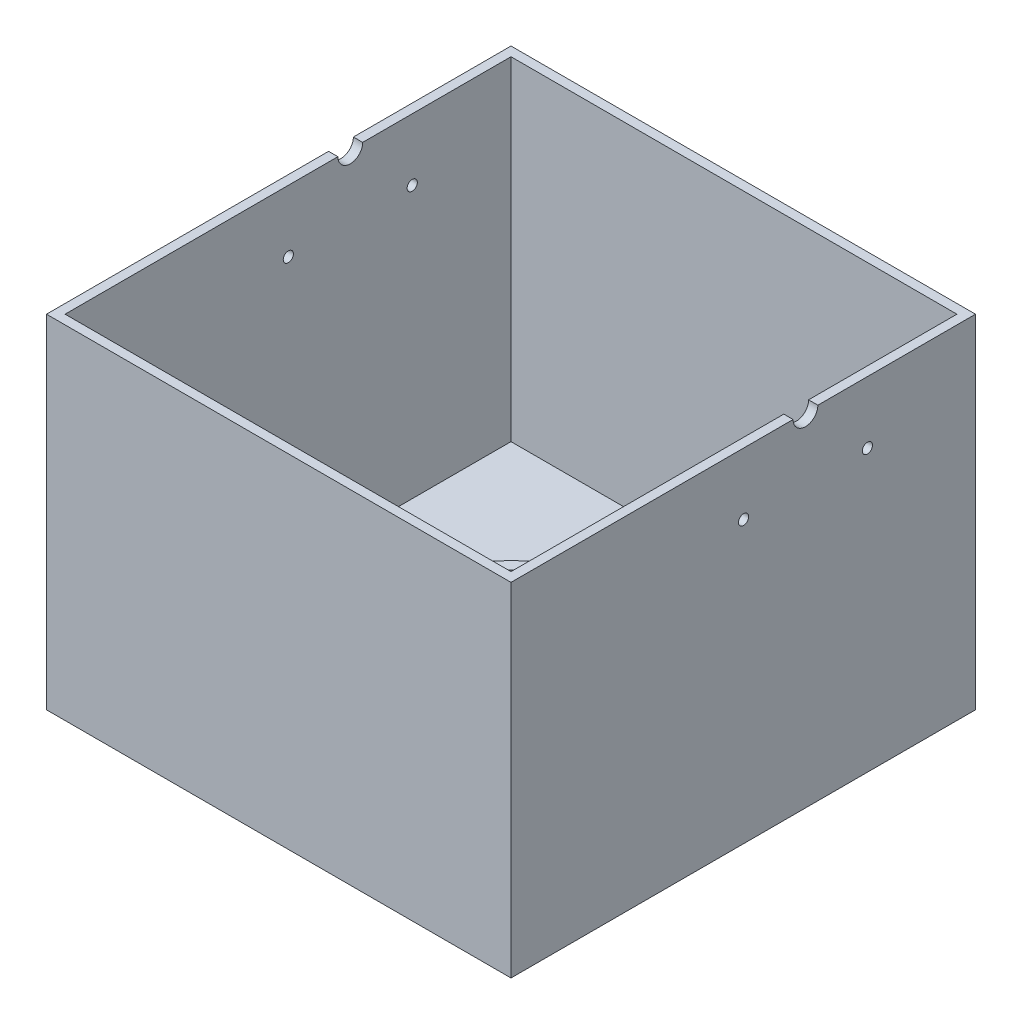
ISO-10303-21;
HEADER;
FILE_DESCRIPTION(('STEP AP214'),'2;1');
FILE_NAME('part.step','',(''),(''),'','','');
FILE_SCHEMA(('AUTOMOTIVE_DESIGN { 1 0 10303 214 1 1 1 1 }'));
ENDSEC;
DATA;
#1=APPLICATION_CONTEXT('core data for automotive mechanical design processes');
#2=APPLICATION_PROTOCOL_DEFINITION('international standard','automotive_design',2000,#1);
#3=PRODUCT_CONTEXT('',#1,'mechanical');
#4=PRODUCT('Part','Part','',(#3));
#5=PRODUCT_RELATED_PRODUCT_CATEGORY('part','',(#4));
#6=PRODUCT_DEFINITION_FORMATION('','',#4);
#7=PRODUCT_DEFINITION_CONTEXT('part definition',#1,'design');
#8=PRODUCT_DEFINITION('design','',#6,#7);
#9=PRODUCT_DEFINITION_SHAPE('','',#8);
#10=(LENGTH_UNIT() NAMED_UNIT(*) SI_UNIT(.MILLI.,.METRE.));
#11=(NAMED_UNIT(*) PLANE_ANGLE_UNIT() SI_UNIT($,.RADIAN.));
#12=(NAMED_UNIT(*) SI_UNIT($,.STERADIAN.) SOLID_ANGLE_UNIT());
#13=UNCERTAINTY_MEASURE_WITH_UNIT(LENGTH_MEASURE(1.E-05),#10,'distance_accuracy_value','');
#14=(GEOMETRIC_REPRESENTATION_CONTEXT(3) GLOBAL_UNCERTAINTY_ASSIGNED_CONTEXT((#13)) GLOBAL_UNIT_ASSIGNED_CONTEXT((#10,
#11,#12)) REPRESENTATION_CONTEXT('',''));
#15=CARTESIAN_POINT('',(0.,0.,0.));
#16=DIRECTION('',(0.,0.,1.));
#17=DIRECTION('',(1.,0.,0.));
#18=AXIS2_PLACEMENT_3D('',#15,#16,#17);
#19=CARTESIAN_POINT('',(0.,3.,0.));
#20=DIRECTION('',(0.,1.,0.));
#21=DIRECTION('',(0.,0.,1.));
#22=AXIS2_PLACEMENT_3D('',#19,#20,#21);
#23=PLANE('',#22);
#24=CARTESIAN_POINT('',(0.,3.,0.));
#25=DIRECTION('',(0.,1.,0.));
#26=DIRECTION('',(0.,0.,1.));
#27=AXIS2_PLACEMENT_3D('',#24,#25,#26);
#28=CIRCLE('',#27,27.5);
#29=CARTESIAN_POINT('',(0.,3.,27.5));
#30=VERTEX_POINT('',#29);
#31=EDGE_CURVE('E190',#30,#30,#28,.T.);
#32=ORIENTED_EDGE('',*,*,#31,.F.);
#33=EDGE_LOOP('',(#32));
#34=FACE_BOUND('',#33,.T.);
#35=CARTESIAN_POINT('',(0.,3.,0.));
#36=DIRECTION('',(0.,1.,0.));
#37=DIRECTION('',(0.,0.,1.));
#38=AXIS2_PLACEMENT_3D('',#35,#36,#37);
#39=CIRCLE('',#38,31.25);
#40=CARTESIAN_POINT('',(0.,3.,31.25));
#41=VERTEX_POINT('',#40);
#42=EDGE_CURVE('E11',#41,#41,#39,.F.);
#43=ORIENTED_EDGE('',*,*,#42,.F.);
#44=EDGE_LOOP('',(#43));
#45=FACE_BOUND('',#44,.T.);
#46=ADVANCED_FACE('F38',(#34,#45),#23,.T.);
#47=CARTESIAN_POINT('',(0.,110.65,0.));
#48=DIRECTION('',(0.,1.,0.));
#49=DIRECTION('',(0.,0.,1.));
#50=AXIS2_PLACEMENT_3D('',#47,#48,#49);
#51=PLANE('',#50);
#52=DIRECTION('',(-1.,0.,0.));
#53=VECTOR('',#52,1.);
#54=CARTESIAN_POINT('',(75.,110.65,-24.1));
#55=LINE('',#54,#53);
#56=CARTESIAN_POINT('',(75.,110.65,-24.1));
#57=VERTEX_POINT('',#56);
#58=CARTESIAN_POINT('',(72.,110.65,-24.1));
#59=VERTEX_POINT('',#58);
#60=EDGE_CURVE('E64',#57,#59,#55,.T.);
#61=ORIENTED_EDGE('',*,*,#60,.F.);
#62=DIRECTION('',(0.,0.,-1.));
#63=VECTOR('',#62,1.);
#64=CARTESIAN_POINT('',(75.,110.65,75.));
#65=LINE('',#64,#63);
#66=CARTESIAN_POINT('',(75.,110.65,-75.));
#67=VERTEX_POINT('',#66);
#68=EDGE_CURVE('E144',#57,#67,#65,.T.);
#69=ORIENTED_EDGE('',*,*,#68,.T.);
#70=DIRECTION('',(-1.,0.,0.));
#71=VECTOR('',#70,1.);
#72=CARTESIAN_POINT('',(75.,110.65,-75.));
#73=LINE('',#72,#71);
#74=CARTESIAN_POINT('',(-75.,110.65,-75.));
#75=VERTEX_POINT('',#74);
#76=EDGE_CURVE('E153',#67,#75,#73,.T.);
#77=ORIENTED_EDGE('',*,*,#76,.T.);
#78=DIRECTION('',(0.,0.,1.));
#79=VECTOR('',#78,1.);
#80=CARTESIAN_POINT('',(-75.,110.65,75.));
#81=LINE('',#80,#79);
#82=CARTESIAN_POINT('',(-75.,110.65,-24.1));
#83=VERTEX_POINT('',#82);
#84=EDGE_CURVE('E294',#75,#83,#81,.T.);
#85=ORIENTED_EDGE('',*,*,#84,.T.);
#86=CARTESIAN_POINT('',(-72.,110.65,-24.1));
#87=VERTEX_POINT('',#86);
#88=EDGE_CURVE('E246',#87,#83,#55,.T.);
#89=ORIENTED_EDGE('',*,*,#88,.F.);
#90=DIRECTION('',(0.,0.,1.));
#91=VECTOR('',#90,1.);
#92=CARTESIAN_POINT('',(-72.,110.65,72.));
#93=LINE('',#92,#91);
#94=CARTESIAN_POINT('',(-72.,110.65,-72.));
#95=VERTEX_POINT('',#94);
#96=EDGE_CURVE('E252',#95,#87,#93,.T.);
#97=ORIENTED_EDGE('',*,*,#96,.F.);
#98=DIRECTION('',(-1.,0.,0.));
#99=VECTOR('',#98,1.);
#100=CARTESIAN_POINT('',(72.,110.65,-72.));
#101=LINE('',#100,#99);
#102=CARTESIAN_POINT('',(72.,110.65,-72.));
#103=VERTEX_POINT('',#102);
#104=EDGE_CURVE('E264',#103,#95,#101,.T.);
#105=ORIENTED_EDGE('',*,*,#104,.F.);
#106=DIRECTION('',(0.,0.,-1.));
#107=VECTOR('',#106,1.);
#108=CARTESIAN_POINT('',(72.,110.65,72.));
#109=LINE('',#108,#107);
#110=EDGE_CURVE('E260',#59,#103,#109,.T.);
#111=ORIENTED_EDGE('',*,*,#110,.F.);
#112=EDGE_LOOP('',(#61,#69,#77,#85,#89,#97,#105,#111));
#113=FACE_BOUND('',#112,.T.);
#114=ADVANCED_FACE('F318',(#113),#51,.T.);
#115=CARTESIAN_POINT('',(75.,3.,-75.));
#116=DIRECTION('',(-1.,0.,0.));
#117=DIRECTION('',(0.,0.,1.));
#118=AXIS2_PLACEMENT_3D('',#115,#116,#117);
#119=PLANE('',#118);
#120=CARTESIAN_POINT('',(75.,90.65,-40.1));
#121=DIRECTION('',(-1.,0.,0.));
#122=DIRECTION('',(0.,0.,1.));
#123=AXIS2_PLACEMENT_3D('',#120,#121,#122);
#124=CIRCLE('',#123,1.65);
#125=CARTESIAN_POINT('',(75.,90.65,-38.45));
#126=VERTEX_POINT('',#125);
#127=EDGE_CURVE('E201',#126,#126,#124,.T.);
#128=ORIENTED_EDGE('',*,*,#127,.T.);
#129=EDGE_LOOP('',(#128));
#130=FACE_BOUND('',#129,.T.);
#131=CARTESIAN_POINT('',(75.,90.65,-0.10000000000001));
#132=DIRECTION('',(-1.,0.,0.));
#133=DIRECTION('',(0.,0.,1.));
#134=AXIS2_PLACEMENT_3D('',#131,#132,#133);
#135=CIRCLE('',#134,1.65);
#136=CARTESIAN_POINT('',(75.,90.65,1.54999999999999));
#137=VERTEX_POINT('',#136);
#138=EDGE_CURVE('E215',#137,#137,#135,.T.);
#139=ORIENTED_EDGE('',*,*,#138,.T.);
#140=EDGE_LOOP('',(#139));
#141=FACE_BOUND('',#140,.T.);
#142=ORIENTED_EDGE('',*,*,#68,.F.);
#143=CARTESIAN_POINT('',(75.,110.65,-20.1));
#144=DIRECTION('',(-1.,0.,0.));
#145=DIRECTION('',(0.,0.,1.));
#146=AXIS2_PLACEMENT_3D('',#143,#144,#145);
#147=CIRCLE('',#146,4.00000000000001);
#148=CARTESIAN_POINT('',(75.,110.65,-16.1));
#149=VERTEX_POINT('',#148);
#150=EDGE_CURVE('E131',#57,#149,#147,.T.);
#151=ORIENTED_EDGE('',*,*,#150,.T.);
#152=CARTESIAN_POINT('',(75.,110.65,75.));
#153=VERTEX_POINT('',#152);
#154=EDGE_CURVE('E142',#153,#149,#65,.T.);
#155=ORIENTED_EDGE('',*,*,#154,.F.);
#156=DIRECTION('',(0.,-1.,0.));
#157=VECTOR('',#156,1.);
#158=CARTESIAN_POINT('',(75.,3.,75.));
#159=LINE('',#158,#157);
#160=CARTESIAN_POINT('',(75.,0.,75.));
#161=VERTEX_POINT('',#160);
#162=EDGE_CURVE('E175',#153,#161,#159,.T.);
#163=ORIENTED_EDGE('',*,*,#162,.T.);
#164=DIRECTION('',(0.,0.,-1.));
#165=VECTOR('',#164,1.);
#166=CARTESIAN_POINT('',(75.,0.,-75.));
#167=LINE('',#166,#165);
#168=CARTESIAN_POINT('',(75.,0.,-75.));
#169=VERTEX_POINT('',#168);
#170=EDGE_CURVE('E158',#161,#169,#167,.T.);
#171=ORIENTED_EDGE('',*,*,#170,.T.);
#172=DIRECTION('',(0.,-1.,0.));
#173=VECTOR('',#172,1.);
#174=CARTESIAN_POINT('',(75.,3.,-75.));
#175=LINE('',#174,#173);
#176=EDGE_CURVE('E186',#67,#169,#175,.T.);
#177=ORIENTED_EDGE('',*,*,#176,.F.);
#178=EDGE_LOOP('',(#142,#151,#155,#163,#171,#177));
#179=FACE_BOUND('',#178,.T.);
#180=ADVANCED_FACE('F40',(#130,#141,#179),#119,.F.);
#181=CARTESIAN_POINT('',(-75.,3.,-75.));
#182=DIRECTION('',(0.,0.,1.));
#183=DIRECTION('',(1.,0.,0.));
#184=AXIS2_PLACEMENT_3D('',#181,#182,#183);
#185=PLANE('',#184);
#186=DIRECTION('',(-1.,0.,0.));
#187=VECTOR('',#186,1.);
#188=CARTESIAN_POINT('',(-75.,0.,-75.));
#189=LINE('',#188,#187);
#190=CARTESIAN_POINT('',(-75.,0.,-75.));
#191=VERTEX_POINT('',#190);
#192=EDGE_CURVE('E166',#169,#191,#189,.T.);
#193=ORIENTED_EDGE('',*,*,#192,.T.);
#194=DIRECTION('',(0.,-1.,0.));
#195=VECTOR('',#194,1.);
#196=CARTESIAN_POINT('',(-75.,3.,-75.));
#197=LINE('',#196,#195);
#198=EDGE_CURVE('E182',#75,#191,#197,.T.);
#199=ORIENTED_EDGE('',*,*,#198,.F.);
#200=ORIENTED_EDGE('',*,*,#76,.F.);
#201=ORIENTED_EDGE('',*,*,#176,.T.);
#202=EDGE_LOOP('',(#193,#199,#200,#201));
#203=FACE_BOUND('',#202,.T.);
#204=ADVANCED_FACE('F317',(#203),#185,.F.);
#205=CARTESIAN_POINT('',(-75.,3.,-75.));
#206=DIRECTION('',(1.,0.,0.));
#207=DIRECTION('',(0.,0.,-1.));
#208=AXIS2_PLACEMENT_3D('',#205,#206,#207);
#209=PLANE('',#208);
#210=CARTESIAN_POINT('',(-75.,90.65,-40.1));
#211=DIRECTION('',(-1.,0.,0.));
#212=DIRECTION('',(0.,0.,1.));
#213=AXIS2_PLACEMENT_3D('',#210,#211,#212);
#214=CIRCLE('',#213,1.65);
#215=CARTESIAN_POINT('',(-75.,90.65,-38.45));
#216=VERTEX_POINT('',#215);
#217=EDGE_CURVE('E209',#216,#216,#214,.T.);
#218=ORIENTED_EDGE('',*,*,#217,.F.);
#219=EDGE_LOOP('',(#218));
#220=FACE_BOUND('',#219,.T.);
#221=CARTESIAN_POINT('',(-75.,90.65,-0.099999999999982));
#222=DIRECTION('',(-1.,0.,0.));
#223=DIRECTION('',(0.,0.,1.));
#224=AXIS2_PLACEMENT_3D('',#221,#222,#223);
#225=CIRCLE('',#224,1.65);
#226=CARTESIAN_POINT('',(-75.,90.65,1.55000000000002));
#227=VERTEX_POINT('',#226);
#228=EDGE_CURVE('E221',#227,#227,#225,.T.);
#229=ORIENTED_EDGE('',*,*,#228,.F.);
#230=EDGE_LOOP('',(#229));
#231=FACE_BOUND('',#230,.T.);
#232=CARTESIAN_POINT('',(-75.,110.65,-16.1));
#233=VERTEX_POINT('',#232);
#234=CARTESIAN_POINT('',(-75.,110.65,75.));
#235=VERTEX_POINT('',#234);
#236=EDGE_CURVE('E293',#233,#235,#81,.T.);
#237=ORIENTED_EDGE('',*,*,#236,.F.);
#238=CARTESIAN_POINT('',(-75.,110.65,-20.1));
#239=DIRECTION('',(-1.,0.,0.));
#240=DIRECTION('',(0.,0.,1.));
#241=AXIS2_PLACEMENT_3D('',#238,#239,#240);
#242=CIRCLE('',#241,4.00000000000001);
#243=EDGE_CURVE('E146',#83,#233,#242,.T.);
#244=ORIENTED_EDGE('',*,*,#243,.F.);
#245=ORIENTED_EDGE('',*,*,#84,.F.);
#246=ORIENTED_EDGE('',*,*,#198,.T.);
#247=DIRECTION('',(0.,0.,1.));
#248=VECTOR('',#247,1.);
#249=CARTESIAN_POINT('',(-75.,0.,-75.));
#250=LINE('',#249,#248);
#251=CARTESIAN_POINT('',(-75.,0.,75.));
#252=VERTEX_POINT('',#251);
#253=EDGE_CURVE('E169',#191,#252,#250,.T.);
#254=ORIENTED_EDGE('',*,*,#253,.T.);
#255=DIRECTION('',(0.,-1.,0.));
#256=VECTOR('',#255,1.);
#257=CARTESIAN_POINT('',(-75.,3.,75.));
#258=LINE('',#257,#256);
#259=EDGE_CURVE('E178',#235,#252,#258,.T.);
#260=ORIENTED_EDGE('',*,*,#259,.F.);
#261=EDGE_LOOP('',(#237,#244,#245,#246,#254,#260));
#262=FACE_BOUND('',#261,.T.);
#263=ADVANCED_FACE('F307',(#220,#231,#262),#209,.F.);
#264=CARTESIAN_POINT('',(-75.,3.,75.));
#265=DIRECTION('',(0.,0.,-1.));
#266=DIRECTION('',(-1.,0.,0.));
#267=AXIS2_PLACEMENT_3D('',#264,#265,#266);
#268=PLANE('',#267);
#269=DIRECTION('',(1.,0.,0.));
#270=VECTOR('',#269,1.);
#271=CARTESIAN_POINT('',(-75.,0.,75.));
#272=LINE('',#271,#270);
#273=EDGE_CURVE('E172',#252,#161,#272,.T.);
#274=ORIENTED_EDGE('',*,*,#273,.T.);
#275=ORIENTED_EDGE('',*,*,#162,.F.);
#276=DIRECTION('',(1.,0.,0.));
#277=VECTOR('',#276,1.);
#278=CARTESIAN_POINT('',(75.,110.65,75.));
#279=LINE('',#278,#277);
#280=EDGE_CURVE('E151',#235,#153,#279,.T.);
#281=ORIENTED_EDGE('',*,*,#280,.F.);
#282=ORIENTED_EDGE('',*,*,#259,.T.);
#283=EDGE_LOOP('',(#274,#275,#281,#282));
#284=FACE_BOUND('',#283,.T.);
#285=ADVANCED_FACE('F311',(#284),#268,.F.);
#286=CARTESIAN_POINT('',(0.,0.,0.));
#287=DIRECTION('',(0.,1.,0.));
#288=DIRECTION('',(0.,0.,1.));
#289=AXIS2_PLACEMENT_3D('',#286,#287,#288);
#290=PLANE('',#289);
#291=CARTESIAN_POINT('',(0.,0.,0.));
#292=DIRECTION('',(0.,-1.,0.));
#293=DIRECTION('',(0.,0.,-1.));
#294=AXIS2_PLACEMENT_3D('',#291,#292,#293);
#295=CIRCLE('',#294,27.5);
#296=CARTESIAN_POINT('',(0.,0.,-27.5));
#297=VERTEX_POINT('',#296);
#298=EDGE_CURVE('E195',#297,#297,#295,.T.);
#299=ORIENTED_EDGE('',*,*,#298,.F.);
#300=EDGE_LOOP('',(#299));
#301=FACE_BOUND('',#300,.T.);
#302=ORIENTED_EDGE('',*,*,#170,.F.);
#303=ORIENTED_EDGE('',*,*,#273,.F.);
#304=ORIENTED_EDGE('',*,*,#253,.F.);
#305=ORIENTED_EDGE('',*,*,#192,.F.);
#306=EDGE_LOOP('',(#302,#303,#304,#305));
#307=FACE_BOUND('',#306,.T.);
#308=ADVANCED_FACE('F314',(#301,#307),#290,.F.);
#309=DIRECTION('',(-1.,0.,0.));
#310=VECTOR('',#309,1.);
#311=CARTESIAN_POINT('',(75.,110.65,-16.1));
#312=LINE('',#311,#310);
#313=CARTESIAN_POINT('',(-72.,110.65,-16.1));
#314=VERTEX_POINT('',#313);
#315=EDGE_CURVE('E56',#233,#314,#312,.F.);
#316=ORIENTED_EDGE('',*,*,#315,.F.);
#317=ORIENTED_EDGE('',*,*,#236,.T.);
#318=ORIENTED_EDGE('',*,*,#280,.T.);
#319=ORIENTED_EDGE('',*,*,#154,.T.);
#320=CARTESIAN_POINT('',(72.,110.65,-16.1));
#321=VERTEX_POINT('',#320);
#322=EDGE_CURVE('E128',#321,#149,#312,.F.);
#323=ORIENTED_EDGE('',*,*,#322,.F.);
#324=CARTESIAN_POINT('',(72.,110.65,72.));
#325=VERTEX_POINT('',#324);
#326=EDGE_CURVE('E261',#325,#321,#109,.T.);
#327=ORIENTED_EDGE('',*,*,#326,.F.);
#328=DIRECTION('',(1.,0.,0.));
#329=VECTOR('',#328,1.);
#330=CARTESIAN_POINT('',(72.,110.65,72.));
#331=LINE('',#330,#329);
#332=CARTESIAN_POINT('',(-72.,110.65,72.));
#333=VERTEX_POINT('',#332);
#334=EDGE_CURVE('E256',#333,#325,#331,.T.);
#335=ORIENTED_EDGE('',*,*,#334,.F.);
#336=EDGE_CURVE('E257',#314,#333,#93,.T.);
#337=ORIENTED_EDGE('',*,*,#336,.F.);
#338=EDGE_LOOP('',(#316,#317,#318,#319,#323,#327,#335,#337));
#339=FACE_BOUND('',#338,.T.);
#340=ADVANCED_FACE('F149',(#339),#51,.T.);
#341=CARTESIAN_POINT('',(-72.,110.65,72.));
#342=DIRECTION('',(1.,0.,0.));
#343=DIRECTION('',(0.,0.,-1.));
#344=AXIS2_PLACEMENT_3D('',#341,#342,#343);
#345=PLANE('',#344);
#346=CARTESIAN_POINT('',(-72.,90.65,-40.1));
#347=DIRECTION('',(1.,0.,0.));
#348=DIRECTION('',(0.,0.,-1.));
#349=AXIS2_PLACEMENT_3D('',#346,#347,#348);
#350=CIRCLE('',#349,1.65);
#351=CARTESIAN_POINT('',(-72.,90.65,-41.75));
#352=VERTEX_POINT('',#351);
#353=EDGE_CURVE('E225',#352,#352,#350,.T.);
#354=ORIENTED_EDGE('',*,*,#353,.F.);
#355=EDGE_LOOP('',(#354));
#356=FACE_BOUND('',#355,.T.);
#357=CARTESIAN_POINT('',(-72.,90.65,-0.0999999999999826));
#358=DIRECTION('',(1.,0.,0.));
#359=DIRECTION('',(0.,0.,-1.));
#360=AXIS2_PLACEMENT_3D('',#357,#358,#359);
#361=CIRCLE('',#360,1.65);
#362=CARTESIAN_POINT('',(-72.,90.65,-1.74999999999998));
#363=VERTEX_POINT('',#362);
#364=EDGE_CURVE('E200',#363,#363,#361,.T.);
#365=ORIENTED_EDGE('',*,*,#364,.F.);
#366=EDGE_LOOP('',(#365));
#367=FACE_BOUND('',#366,.T.);
#368=CARTESIAN_POINT('',(-72.,110.65,-20.1));
#369=DIRECTION('',(1.,0.,0.));
#370=DIRECTION('',(0.,0.,-1.));
#371=AXIS2_PLACEMENT_3D('',#368,#369,#370);
#372=CIRCLE('',#371,4.00000000000001);
#373=EDGE_CURVE('E245',#314,#87,#372,.T.);
#374=ORIENTED_EDGE('',*,*,#373,.F.);
#375=ORIENTED_EDGE('',*,*,#336,.T.);
#376=DIRECTION('',(0.,-1.,0.));
#377=VECTOR('',#376,1.);
#378=CARTESIAN_POINT('',(-72.,110.65,72.));
#379=LINE('',#378,#377);
#380=CARTESIAN_POINT('',(-72.,3.,72.));
#381=VERTEX_POINT('',#380);
#382=EDGE_CURVE('E290',#333,#381,#379,.T.);
#383=ORIENTED_EDGE('',*,*,#382,.T.);
#384=DIRECTION('',(0.,0.,1.));
#385=VECTOR('',#384,1.);
#386=CARTESIAN_POINT('',(-72.,3.,72.));
#387=LINE('',#386,#385);
#388=CARTESIAN_POINT('',(-72.,3.,-72.));
#389=VERTEX_POINT('',#388);
#390=EDGE_CURVE('E194',#389,#381,#387,.T.);
#391=ORIENTED_EDGE('',*,*,#390,.F.);
#392=DIRECTION('',(0.,-1.,0.));
#393=VECTOR('',#392,1.);
#394=CARTESIAN_POINT('',(-72.,110.65,-72.));
#395=LINE('',#394,#393);
#396=EDGE_CURVE('E267',#95,#389,#395,.T.);
#397=ORIENTED_EDGE('',*,*,#396,.F.);
#398=ORIENTED_EDGE('',*,*,#96,.T.);
#399=EDGE_LOOP('',(#374,#375,#383,#391,#397,#398));
#400=FACE_BOUND('',#399,.T.);
#401=ADVANCED_FACE('F345',(#356,#367,#400),#345,.T.);
#402=CARTESIAN_POINT('',(72.,110.65,72.));
#403=DIRECTION('',(0.,0.,-1.));
#404=DIRECTION('',(-1.,0.,0.));
#405=AXIS2_PLACEMENT_3D('',#402,#403,#404);
#406=PLANE('',#405);
#407=DIRECTION('',(1.,0.,0.));
#408=VECTOR('',#407,1.);
#409=CARTESIAN_POINT('',(72.,3.,72.));
#410=LINE('',#409,#408);
#411=CARTESIAN_POINT('',(72.,3.,72.));
#412=VERTEX_POINT('',#411);
#413=EDGE_CURVE('E270',#381,#412,#410,.T.);
#414=ORIENTED_EDGE('',*,*,#413,.F.);
#415=ORIENTED_EDGE('',*,*,#382,.F.);
#416=ORIENTED_EDGE('',*,*,#334,.T.);
#417=DIRECTION('',(0.,-1.,0.));
#418=VECTOR('',#417,1.);
#419=CARTESIAN_POINT('',(72.,110.65,72.));
#420=LINE('',#419,#418);
#421=EDGE_CURVE('E286',#325,#412,#420,.T.);
#422=ORIENTED_EDGE('',*,*,#421,.T.);
#423=EDGE_LOOP('',(#414,#415,#416,#422));
#424=FACE_BOUND('',#423,.T.);
#425=ADVANCED_FACE('F334',(#424),#406,.T.);
#426=CARTESIAN_POINT('',(72.,110.65,72.));
#427=DIRECTION('',(-1.,0.,0.));
#428=DIRECTION('',(0.,0.,1.));
#429=AXIS2_PLACEMENT_3D('',#426,#427,#428);
#430=PLANE('',#429);
#431=CARTESIAN_POINT('',(72.,90.65,-40.1));
#432=DIRECTION('',(-1.,0.,0.));
#433=DIRECTION('',(0.,0.,1.));
#434=AXIS2_PLACEMENT_3D('',#431,#432,#433);
#435=CIRCLE('',#434,1.65);
#436=CARTESIAN_POINT('',(72.,90.65,-38.45));
#437=VERTEX_POINT('',#436);
#438=EDGE_CURVE('E42',#437,#437,#435,.T.);
#439=ORIENTED_EDGE('',*,*,#438,.F.);
#440=EDGE_LOOP('',(#439));
#441=FACE_BOUND('',#440,.T.);
#442=CARTESIAN_POINT('',(72.,90.65,-0.100000000000009));
#443=DIRECTION('',(-1.,0.,0.));
#444=DIRECTION('',(0.,0.,1.));
#445=AXIS2_PLACEMENT_3D('',#442,#443,#444);
#446=CIRCLE('',#445,1.65);
#447=CARTESIAN_POINT('',(72.,90.65,1.54999999999999));
#448=VERTEX_POINT('',#447);
#449=EDGE_CURVE('E197',#448,#448,#446,.T.);
#450=ORIENTED_EDGE('',*,*,#449,.F.);
#451=EDGE_LOOP('',(#450));
#452=FACE_BOUND('',#451,.T.);
#453=CARTESIAN_POINT('',(72.,110.65,-20.1));
#454=DIRECTION('',(-1.,0.,0.));
#455=DIRECTION('',(0.,0.,1.));
#456=AXIS2_PLACEMENT_3D('',#453,#454,#455);
#457=CIRCLE('',#456,4.00000000000001);
#458=EDGE_CURVE('E48',#59,#321,#457,.T.);
#459=ORIENTED_EDGE('',*,*,#458,.F.);
#460=ORIENTED_EDGE('',*,*,#110,.T.);
#461=DIRECTION('',(0.,-1.,0.));
#462=VECTOR('',#461,1.);
#463=CARTESIAN_POINT('',(72.,110.65,-72.));
#464=LINE('',#463,#462);
#465=CARTESIAN_POINT('',(72.,3.,-72.));
#466=VERTEX_POINT('',#465);
#467=EDGE_CURVE('E282',#103,#466,#464,.T.);
#468=ORIENTED_EDGE('',*,*,#467,.T.);
#469=DIRECTION('',(0.,0.,-1.));
#470=VECTOR('',#469,1.);
#471=CARTESIAN_POINT('',(72.,3.,72.));
#472=LINE('',#471,#470);
#473=EDGE_CURVE('E273',#412,#466,#472,.T.);
#474=ORIENTED_EDGE('',*,*,#473,.F.);
#475=ORIENTED_EDGE('',*,*,#421,.F.);
#476=ORIENTED_EDGE('',*,*,#326,.T.);
#477=EDGE_LOOP('',(#459,#460,#468,#474,#475,#476));
#478=FACE_BOUND('',#477,.T.);
#479=ADVANCED_FACE('F330',(#441,#452,#478),#430,.T.);
#480=CARTESIAN_POINT('',(72.,110.65,-72.));
#481=DIRECTION('',(0.,0.,1.));
#482=DIRECTION('',(1.,0.,0.));
#483=AXIS2_PLACEMENT_3D('',#480,#481,#482);
#484=PLANE('',#483);
#485=DIRECTION('',(-1.,0.,0.));
#486=VECTOR('',#485,1.);
#487=CARTESIAN_POINT('',(72.,3.,-72.));
#488=LINE('',#487,#486);
#489=EDGE_CURVE('E276',#466,#389,#488,.T.);
#490=ORIENTED_EDGE('',*,*,#489,.F.);
#491=ORIENTED_EDGE('',*,*,#467,.F.);
#492=ORIENTED_EDGE('',*,*,#104,.T.);
#493=ORIENTED_EDGE('',*,*,#396,.T.);
#494=EDGE_LOOP('',(#490,#491,#492,#493));
#495=FACE_BOUND('',#494,.T.);
#496=ADVANCED_FACE('F333',(#495),#484,.T.);
#497=CARTESIAN_POINT('',(0.,3.,0.));
#498=DIRECTION('',(0.,1.,0.));
#499=DIRECTION('',(0.,0.,1.));
#500=AXIS2_PLACEMENT_3D('',#497,#498,#499);
#501=CIRCLE('',#500,35.);
#502=CARTESIAN_POINT('',(0.,3.,35.));
#503=VERTEX_POINT('',#502);
#504=EDGE_CURVE('E233',#503,#503,#501,.T.);
#505=ORIENTED_EDGE('',*,*,#504,.F.);
#506=EDGE_LOOP('',(#505));
#507=FACE_BOUND('',#506,.T.);
#508=ORIENTED_EDGE('',*,*,#390,.T.);
#509=ORIENTED_EDGE('',*,*,#413,.T.);
#510=ORIENTED_EDGE('',*,*,#473,.T.);
#511=ORIENTED_EDGE('',*,*,#489,.T.);
#512=EDGE_LOOP('',(#508,#509,#510,#511));
#513=FACE_BOUND('',#512,.T.);
#514=ADVANCED_FACE('F352',(#507,#513),#23,.T.);
#515=CARTESIAN_POINT('',(0.,91.,0.));
#516=DIRECTION('',(0.,-1.,0.));
#517=DIRECTION('',(0.,0.,-1.));
#518=AXIS2_PLACEMENT_3D('',#515,#516,#517);
#519=CYLINDRICAL_SURFACE('',#518,27.5);
#520=ORIENTED_EDGE('',*,*,#31,.T.);
#521=EDGE_LOOP('',(#520));
#522=FACE_BOUND('',#521,.T.);
#523=ORIENTED_EDGE('',*,*,#298,.T.);
#524=EDGE_LOOP('',(#523));
#525=FACE_BOUND('',#524,.T.);
#526=ADVANCED_FACE('F362',(#522,#525),#519,.F.);
#527=CARTESIAN_POINT('',(75.,110.65,-20.1));
#528=DIRECTION('',(-1.,0.,0.));
#529=DIRECTION('',(0.,0.,1.));
#530=AXIS2_PLACEMENT_3D('',#527,#528,#529);
#531=CYLINDRICAL_SURFACE('',#530,4.00000000000001);
#532=ORIENTED_EDGE('',*,*,#60,.T.);
#533=ORIENTED_EDGE('',*,*,#458,.T.);
#534=ORIENTED_EDGE('',*,*,#322,.T.);
#535=ORIENTED_EDGE('',*,*,#150,.F.);
#536=EDGE_LOOP('',(#532,#533,#534,#535));
#537=FACE_BOUND('',#536,.T.);
#538=ADVANCED_FACE('F130',(#537),#531,.F.);
#539=ORIENTED_EDGE('',*,*,#88,.T.);
#540=ORIENTED_EDGE('',*,*,#243,.T.);
#541=ORIENTED_EDGE('',*,*,#315,.T.);
#542=ORIENTED_EDGE('',*,*,#373,.T.);
#543=EDGE_LOOP('',(#539,#540,#541,#542));
#544=FACE_BOUND('',#543,.T.);
#545=ADVANCED_FACE('F319',(#544),#531,.F.);
#546=CARTESIAN_POINT('',(0.,17.,0.));
#547=DIRECTION('',(0.,1.,0.));
#548=DIRECTION('',(0.,0.,1.));
#549=AXIS2_PLACEMENT_3D('',#546,#547,#548);
#550=PLANE('',#549);
#551=CARTESIAN_POINT('',(0.,17.,0.));
#552=DIRECTION('',(0.,1.,0.));
#553=DIRECTION('',(0.,0.,1.));
#554=AXIS2_PLACEMENT_3D('',#551,#552,#553);
#555=CIRCLE('',#554,35.);
#556=CARTESIAN_POINT('',(0.,17.,35.));
#557=VERTEX_POINT('',#556);
#558=EDGE_CURVE('E234',#557,#557,#555,.T.);
#559=ORIENTED_EDGE('',*,*,#558,.T.);
#560=EDGE_LOOP('',(#559));
#561=FACE_BOUND('',#560,.T.);
#562=CARTESIAN_POINT('',(0.,17.,0.));
#563=DIRECTION('',(0.,1.,0.));
#564=DIRECTION('',(0.,0.,1.));
#565=AXIS2_PLACEMENT_3D('',#562,#563,#564);
#566=CIRCLE('',#565,31.25);
#567=CARTESIAN_POINT('',(0.,17.,31.25));
#568=VERTEX_POINT('',#567);
#569=EDGE_CURVE('E229',#568,#568,#566,.T.);
#570=ORIENTED_EDGE('',*,*,#569,.F.);
#571=EDGE_LOOP('',(#570));
#572=FACE_BOUND('',#571,.T.);
#573=ADVANCED_FACE('F482',(#561,#572),#550,.T.);
#574=CARTESIAN_POINT('',(0.,17.,0.));
#575=DIRECTION('',(0.,-1.,0.));
#576=DIRECTION('',(0.,0.,-1.));
#577=AXIS2_PLACEMENT_3D('',#574,#575,#576);
#578=CYLINDRICAL_SURFACE('',#577,35.);
#579=ORIENTED_EDGE('',*,*,#558,.F.);
#580=EDGE_LOOP('',(#579));
#581=FACE_BOUND('',#580,.T.);
#582=ORIENTED_EDGE('',*,*,#504,.T.);
#583=EDGE_LOOP('',(#582));
#584=FACE_BOUND('',#583,.T.);
#585=ADVANCED_FACE('F405',(#581,#584),#578,.T.);
#586=CARTESIAN_POINT('',(0.,17.,0.));
#587=DIRECTION('',(0.,-1.,0.));
#588=DIRECTION('',(0.,0.,-1.));
#589=AXIS2_PLACEMENT_3D('',#586,#587,#588);
#590=CYLINDRICAL_SURFACE('',#589,31.25);
#591=ORIENTED_EDGE('',*,*,#569,.T.);
#592=EDGE_LOOP('',(#591));
#593=FACE_BOUND('',#592,.T.);
#594=ORIENTED_EDGE('',*,*,#42,.T.);
#595=EDGE_LOOP('',(#594));
#596=FACE_BOUND('',#595,.T.);
#597=ADVANCED_FACE('F396',(#593,#596),#590,.F.);
#598=CARTESIAN_POINT('',(75.,90.65,-0.10000000000001));
#599=DIRECTION('',(-1.,0.,0.));
#600=DIRECTION('',(0.,0.,1.));
#601=AXIS2_PLACEMENT_3D('',#598,#599,#600);
#602=CYLINDRICAL_SURFACE('',#601,1.65);
#603=ORIENTED_EDGE('',*,*,#449,.T.);
#604=EDGE_LOOP('',(#603));
#605=FACE_BOUND('',#604,.T.);
#606=ORIENTED_EDGE('',*,*,#138,.F.);
#607=EDGE_LOOP('',(#606));
#608=FACE_BOUND('',#607,.T.);
#609=ADVANCED_FACE('F394',(#605,#608),#602,.F.);
#610=CARTESIAN_POINT('',(75.,90.65,-40.1));
#611=DIRECTION('',(-1.,0.,0.));
#612=DIRECTION('',(0.,0.,1.));
#613=AXIS2_PLACEMENT_3D('',#610,#611,#612);
#614=CYLINDRICAL_SURFACE('',#613,1.65);
#615=ORIENTED_EDGE('',*,*,#438,.T.);
#616=EDGE_LOOP('',(#615));
#617=FACE_BOUND('',#616,.T.);
#618=ORIENTED_EDGE('',*,*,#127,.F.);
#619=EDGE_LOOP('',(#618));
#620=FACE_BOUND('',#619,.T.);
#621=ADVANCED_FACE('F327',(#617,#620),#614,.F.);
#622=ORIENTED_EDGE('',*,*,#364,.T.);
#623=EDGE_LOOP('',(#622));
#624=FACE_BOUND('',#623,.T.);
#625=ORIENTED_EDGE('',*,*,#228,.T.);
#626=EDGE_LOOP('',(#625));
#627=FACE_BOUND('',#626,.T.);
#628=ADVANCED_FACE('F398',(#624,#627),#602,.F.);
#629=ORIENTED_EDGE('',*,*,#353,.T.);
#630=EDGE_LOOP('',(#629));
#631=FACE_BOUND('',#630,.T.);
#632=ORIENTED_EDGE('',*,*,#217,.T.);
#633=EDGE_LOOP('',(#632));
#634=FACE_BOUND('',#633,.T.);
#635=ADVANCED_FACE('F404',(#631,#634),#614,.F.);
#636=CLOSED_SHELL('',(#46,#114,#180,#204,#263,#285,#308,#340,#401,#425,#479,#496,#514,#526,#538,
#545,#573,#585,#597,#609,#621,#628,#635));
#637=MANIFOLD_SOLID_BREP('B2',#636);
#638=ADVANCED_BREP_SHAPE_REPRESENTATION('',(#18,#637),#14);
#639=SHAPE_DEFINITION_REPRESENTATION(#9,#638);
ENDSEC;
END-ISO-10303-21;
